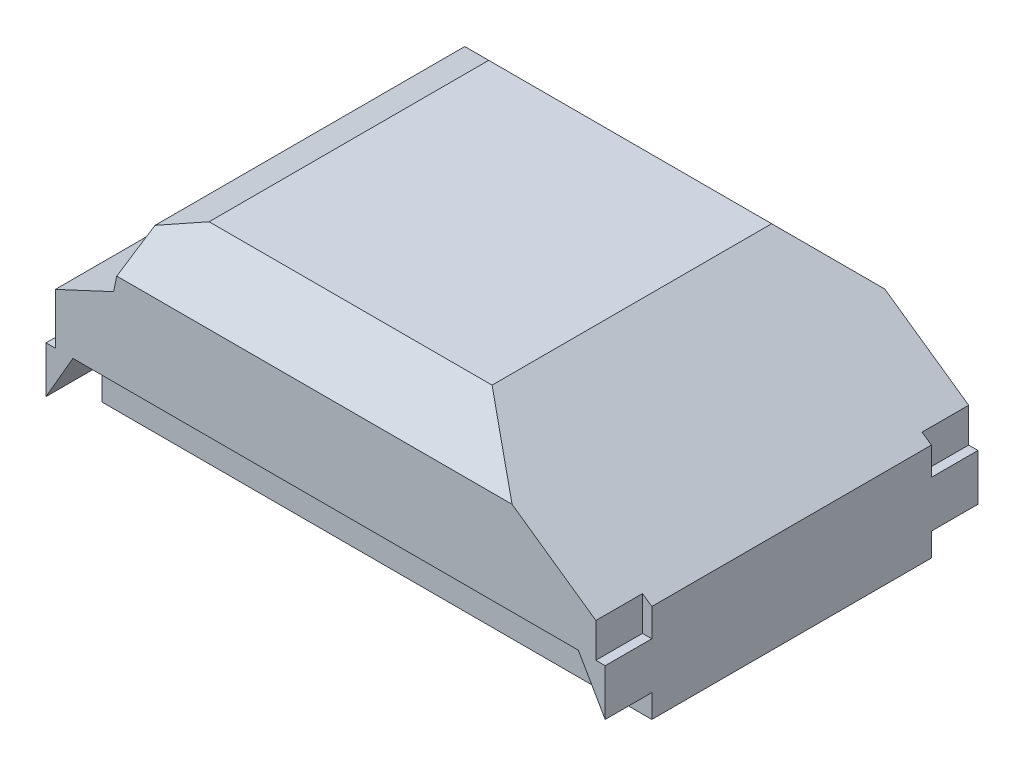
ISO-10303-21;
HEADER;
FILE_DESCRIPTION(('STEP AP214'),'2;1');
FILE_NAME('part.step','',(''),(''),'','','');
FILE_SCHEMA(('AUTOMOTIVE_DESIGN { 1 0 10303 214 1 1 1 1 }'));
ENDSEC;
DATA;
#1=APPLICATION_CONTEXT('core data for automotive mechanical design processes');
#2=APPLICATION_PROTOCOL_DEFINITION('international standard','automotive_design',2000,#1);
#3=PRODUCT_CONTEXT('',#1,'mechanical');
#4=PRODUCT('Part','Part','',(#3));
#5=PRODUCT_RELATED_PRODUCT_CATEGORY('part','',(#4));
#6=PRODUCT_DEFINITION_FORMATION('','',#4);
#7=PRODUCT_DEFINITION_CONTEXT('part definition',#1,'design');
#8=PRODUCT_DEFINITION('design','',#6,#7);
#9=PRODUCT_DEFINITION_SHAPE('','',#8);
#10=(LENGTH_UNIT() NAMED_UNIT(*) SI_UNIT(.MILLI.,.METRE.));
#11=(NAMED_UNIT(*) PLANE_ANGLE_UNIT() SI_UNIT($,.RADIAN.));
#12=(NAMED_UNIT(*) SI_UNIT($,.STERADIAN.) SOLID_ANGLE_UNIT());
#13=UNCERTAINTY_MEASURE_WITH_UNIT(LENGTH_MEASURE(1.E-05),#10,'distance_accuracy_value','');
#14=(GEOMETRIC_REPRESENTATION_CONTEXT(3) GLOBAL_UNCERTAINTY_ASSIGNED_CONTEXT((#13)) GLOBAL_UNIT_ASSIGNED_CONTEXT((#10,
#11,#12)) REPRESENTATION_CONTEXT('',''));
#15=CARTESIAN_POINT('',(0.,0.,0.));
#16=DIRECTION('',(0.,0.,1.));
#17=DIRECTION('',(1.,0.,0.));
#18=AXIS2_PLACEMENT_3D('',#15,#16,#17);
#19=CARTESIAN_POINT('',(0.,74.8916505008483,0.));
#20=DIRECTION('',(0.,-1.,0.));
#21=DIRECTION('',(0.,0.,-1.));
#22=AXIS2_PLACEMENT_3D('',#19,#20,#21);
#23=PLANE('',#22);
#24=DIRECTION('',(0.,0.,-1.));
#25=VECTOR('',#24,1.);
#26=CARTESIAN_POINT('',(113.092371629918,74.8916505008483,195.747597125653));
#27=LINE('',#26,#25);
#28=CARTESIAN_POINT('',(113.092371629918,74.8916505008483,92.1829002882369));
#29=VERTEX_POINT('',#28);
#30=CARTESIAN_POINT('',(113.092371629918,74.8916505008483,79.4829002882369));
#31=VERTEX_POINT('',#30);
#32=EDGE_CURVE('E303',#29,#31,#27,.T.);
#33=ORIENTED_EDGE('',*,*,#32,.F.);
#34=DIRECTION('',(1.,0.,0.));
#35=VECTOR('',#34,1.);
#36=CARTESIAN_POINT('',(-29.4352799513737,74.8916505008483,92.1829002882369));
#37=LINE('',#36,#35);
#38=CARTESIAN_POINT('',(-24.6429315326656,74.8916505008483,92.1829002882369));
#39=VERTEX_POINT('',#38);
#40=EDGE_CURVE('E483',#39,#29,#37,.T.);
#41=ORIENTED_EDGE('',*,*,#40,.F.);
#42=DIRECTION('',(0.,0.,-1.));
#43=VECTOR('',#42,1.);
#44=CARTESIAN_POINT('',(-24.6429315326656,74.8916505008483,195.747597125653));
#45=LINE('',#44,#43);
#46=CARTESIAN_POINT('',(-24.6429315326656,74.8916505008483,79.4829002882369));
#47=VERTEX_POINT('',#46);
#48=EDGE_CURVE('E316',#39,#47,#45,.T.);
#49=ORIENTED_EDGE('',*,*,#48,.T.);
#50=DIRECTION('',(-1.,0.,0.));
#51=VECTOR('',#50,1.);
#52=CARTESIAN_POINT('',(-29.4352799513737,74.8916505008483,79.4829002882369));
#53=LINE('',#52,#51);
#54=EDGE_CURVE('E403',#31,#47,#53,.T.);
#55=ORIENTED_EDGE('',*,*,#54,.F.);
#56=EDGE_LOOP('',(#33,#41,#49,#55));
#57=FACE_BOUND('',#56,.T.);
#58=ADVANCED_FACE('F33',(#57),#23,.T.);
#59=CARTESIAN_POINT('',(-24.6429315326656,74.8916505008483,181.082900288237));
#60=VERTEX_POINT('',#59);
#61=CARTESIAN_POINT('',(-24.6429315326656,74.8916505008483,168.382900288237));
#62=VERTEX_POINT('',#61);
#63=EDGE_CURVE('E325',#60,#62,#45,.T.);
#64=ORIENTED_EDGE('',*,*,#63,.T.);
#65=DIRECTION('',(-1.,0.,0.));
#66=VECTOR('',#65,1.);
#67=CARTESIAN_POINT('',(-29.4352799513737,74.8916505008483,168.382900288237));
#68=LINE('',#67,#66);
#69=CARTESIAN_POINT('',(113.092371629918,74.8916505008483,168.382900288237));
#70=VERTEX_POINT('',#69);
#71=EDGE_CURVE('E248',#70,#62,#68,.T.);
#72=ORIENTED_EDGE('',*,*,#71,.F.);
#73=CARTESIAN_POINT('',(113.092371629918,74.8916505008483,181.082900288237));
#74=VERTEX_POINT('',#73);
#75=EDGE_CURVE('E304',#74,#70,#27,.T.);
#76=ORIENTED_EDGE('',*,*,#75,.F.);
#77=DIRECTION('',(1.,0.,0.));
#78=VECTOR('',#77,1.);
#79=CARTESIAN_POINT('',(117.884720048626,74.8916505008483,181.082900288237));
#80=LINE('',#79,#78);
#81=EDGE_CURVE('E388',#60,#74,#80,.T.);
#82=ORIENTED_EDGE('',*,*,#81,.F.);
#83=EDGE_LOOP('',(#64,#72,#76,#82));
#84=FACE_BOUND('',#83,.T.);
#85=ADVANCED_FACE('F481',(#84),#23,.T.);
#86=CARTESIAN_POINT('',(-31.9752799513737,62.1916505008483,195.747597125653));
#87=DIRECTION('',(-0.866025403784442,0.499999999999995,0.));
#88=DIRECTION('',(-0.499999999999995,-0.866025403784442,0.));
#89=AXIS2_PLACEMENT_3D('',#86,#87,#88);
#90=PLANE('',#89);
#91=DIRECTION('',(0.499999999999995,0.866025403784442,0.));
#92=VECTOR('',#91,1.);
#93=CARTESIAN_POINT('',(-31.9752799513737,62.1916505008483,92.1829002882369));
#94=LINE('',#93,#92);
#95=CARTESIAN_POINT('',(-29.4352799513737,66.5910595520733,92.1829002882369));
#96=VERTEX_POINT('',#95);
#97=EDGE_CURVE('E48',#96,#39,#94,.T.);
#98=ORIENTED_EDGE('',*,*,#97,.F.);
#99=DIRECTION('',(0.,0.,-1.));
#100=VECTOR('',#99,1.);
#101=CARTESIAN_POINT('',(-29.4352799513737,66.5910595520733,195.747597125653));
#102=LINE('',#101,#100);
#103=CARTESIAN_POINT('',(-29.4352799513737,66.5910595520733,168.382900288237));
#104=VERTEX_POINT('',#103);
#105=EDGE_CURVE('E52',#104,#96,#102,.T.);
#106=ORIENTED_EDGE('',*,*,#105,.F.);
#107=DIRECTION('',(-0.499999999999995,-0.866025403784442,0.));
#108=VECTOR('',#107,1.);
#109=CARTESIAN_POINT('',(-31.9752799513737,62.1916505008483,168.382900288237));
#110=LINE('',#109,#108);
#111=EDGE_CURVE('E251',#62,#104,#110,.T.);
#112=ORIENTED_EDGE('',*,*,#111,.F.);
#113=ORIENTED_EDGE('',*,*,#63,.F.);
#114=DIRECTION('',(-0.499999999999995,-0.866025403784442,0.));
#115=VECTOR('',#114,1.);
#116=CARTESIAN_POINT('',(-31.9752799513737,62.1916505008483,181.082900288237));
#117=LINE('',#116,#115);
#118=CARTESIAN_POINT('',(-31.9752799513737,62.1916505008483,181.082900288237));
#119=VERTEX_POINT('',#118);
#120=EDGE_CURVE('E321',#60,#119,#117,.T.);
#121=ORIENTED_EDGE('',*,*,#120,.T.);
#122=DIRECTION('',(0.,0.,-1.));
#123=VECTOR('',#122,1.);
#124=CARTESIAN_POINT('',(-31.9752799513737,62.1916505008483,195.747597125653));
#125=LINE('',#124,#123);
#126=CARTESIAN_POINT('',(-31.9752799513737,62.1916505008483,79.4829002882369));
#127=VERTEX_POINT('',#126);
#128=EDGE_CURVE('E328',#119,#127,#125,.T.);
#129=ORIENTED_EDGE('',*,*,#128,.T.);
#130=DIRECTION('',(-0.499999999999994,-0.866025403784442,0.));
#131=VECTOR('',#130,1.);
#132=CARTESIAN_POINT('',(-31.9752799513737,62.1916505008483,79.4829002882369));
#133=LINE('',#132,#131);
#134=EDGE_CURVE('E296',#47,#127,#133,.T.);
#135=ORIENTED_EDGE('',*,*,#134,.F.);
#136=ORIENTED_EDGE('',*,*,#48,.F.);
#137=EDGE_LOOP('',(#98,#106,#112,#113,#121,#129,#135,#136));
#138=FACE_BOUND('',#137,.T.);
#139=ADVANCED_FACE('F504',(#138),#90,.F.);
#140=CARTESIAN_POINT('',(120.424720048626,62.1916505008483,195.747597125653));
#141=DIRECTION('',(0.866025403784441,0.499999999999997,0.));
#142=DIRECTION('',(-0.499999999999997,0.866025403784441,0.));
#143=AXIS2_PLACEMENT_3D('',#140,#141,#142);
#144=PLANE('',#143);
#145=DIRECTION('',(0.499999999999997,-0.866025403784441,0.));
#146=VECTOR('',#145,1.);
#147=CARTESIAN_POINT('',(120.424720048626,62.1916505008483,92.1829002882369));
#148=LINE('',#147,#146);
#149=CARTESIAN_POINT('',(120.424720048626,62.1916505008483,92.1829002882369));
#150=VERTEX_POINT('',#149);
#151=EDGE_CURVE('E11',#29,#150,#148,.T.);
#152=ORIENTED_EDGE('',*,*,#151,.F.);
#153=ORIENTED_EDGE('',*,*,#32,.T.);
#154=DIRECTION('',(-0.499999999999997,0.866025403784441,0.));
#155=VECTOR('',#154,1.);
#156=CARTESIAN_POINT('',(120.424720048626,62.1916505008483,79.4829002882369));
#157=LINE('',#156,#155);
#158=CARTESIAN_POINT('',(120.424720048626,62.1916505008483,79.4829002882369));
#159=VERTEX_POINT('',#158);
#160=EDGE_CURVE('E287',#159,#31,#157,.T.);
#161=ORIENTED_EDGE('',*,*,#160,.F.);
#162=DIRECTION('',(0.,0.,-1.));
#163=VECTOR('',#162,1.);
#164=CARTESIAN_POINT('',(120.424720048626,62.1916505008483,195.747597125653));
#165=LINE('',#164,#163);
#166=EDGE_CURVE('E299',#150,#159,#165,.T.);
#167=ORIENTED_EDGE('',*,*,#166,.F.);
#168=EDGE_LOOP('',(#152,#153,#161,#167));
#169=FACE_BOUND('',#168,.T.);
#170=ADVANCED_FACE('F499',(#169),#144,.F.);
#171=DIRECTION('',(-0.499999999999997,0.866025403784441,0.));
#172=VECTOR('',#171,1.);
#173=CARTESIAN_POINT('',(120.424720048626,62.1916505008483,168.382900288237));
#174=LINE('',#173,#172);
#175=CARTESIAN_POINT('',(120.424720048626,62.1916505008483,168.382900288237));
#176=VERTEX_POINT('',#175);
#177=EDGE_CURVE('E41',#176,#70,#174,.T.);
#178=ORIENTED_EDGE('',*,*,#177,.F.);
#179=CARTESIAN_POINT('',(120.424720048626,62.1916505008483,181.082900288237));
#180=VERTEX_POINT('',#179);
#181=EDGE_CURVE('E300',#180,#176,#165,.T.);
#182=ORIENTED_EDGE('',*,*,#181,.F.);
#183=DIRECTION('',(-0.499999999999997,0.866025403784441,0.));
#184=VECTOR('',#183,1.);
#185=CARTESIAN_POINT('',(120.424720048626,62.1916505008483,181.082900288237));
#186=LINE('',#185,#184);
#187=EDGE_CURVE('E291',#180,#74,#186,.T.);
#188=ORIENTED_EDGE('',*,*,#187,.T.);
#189=ORIENTED_EDGE('',*,*,#75,.T.);
#190=EDGE_LOOP('',(#178,#182,#188,#189));
#191=FACE_BOUND('',#190,.T.);
#192=ADVANCED_FACE('F469',(#191),#144,.F.);
#193=CARTESIAN_POINT('',(117.884720048626,112.991650500848,181.082900288237));
#194=DIRECTION('',(0.,0.,-1.));
#195=DIRECTION('',(-1.,0.,0.));
#196=AXIS2_PLACEMENT_3D('',#193,#194,#195);
#197=PLANE('',#196);
#198=DIRECTION('',(0.819152044288995,-0.573576436351041,0.));
#199=VECTOR('',#198,1.);
#200=CARTESIAN_POINT('',(76.8947688031261,112.991650500848,181.082900288237));
#201=LINE('',#200,#199);
#202=CARTESIAN_POINT('',(95.0322484887511,100.291650500848,181.082900288237));
#203=VERTEX_POINT('',#202);
#204=CARTESIAN_POINT('',(117.884720048626,84.2901776479009,181.082900288237));
#205=VERTEX_POINT('',#204);
#206=EDGE_CURVE('E324',#203,#205,#201,.T.);
#207=ORIENTED_EDGE('',*,*,#206,.F.);
#208=DIRECTION('',(1.,0.,0.));
#209=VECTOR('',#208,1.);
#210=CARTESIAN_POINT('',(-31.9752799513737,100.291650500848,181.082900288237));
#211=LINE('',#210,#209);
#212=CARTESIAN_POINT('',(-12.6849887689477,100.291650500848,181.082900288237));
#213=VERTEX_POINT('',#212);
#214=EDGE_CURVE('E265',#213,#203,#211,.T.);
#215=ORIENTED_EDGE('',*,*,#214,.F.);
#216=DIRECTION('',(0.207911690817752,0.978147600733807,0.));
#217=VECTOR('',#216,1.);
#218=CARTESIAN_POINT('',(-13.559105718789,96.1792535794193,181.082900288237));
#219=LINE('',#218,#217);
#220=CARTESIAN_POINT('',(-13.559105718789,96.1792535794193,181.082900288237));
#221=VERTEX_POINT('',#220);
#222=EDGE_CURVE('E338',#221,#213,#219,.T.);
#223=ORIENTED_EDGE('',*,*,#222,.F.);
#224=DIRECTION('',(0.906307787036649,0.422618261740701,0.));
#225=VECTOR('',#224,1.);
#226=CARTESIAN_POINT('',(-31.9752799513737,87.5916505008482,181.082900288237));
#227=LINE('',#226,#225);
#228=CARTESIAN_POINT('',(-29.4352799513737,88.7760719525619,181.082900288237));
#229=VERTEX_POINT('',#228);
#230=EDGE_CURVE('E336',#229,#221,#227,.T.);
#231=ORIENTED_EDGE('',*,*,#230,.F.);
#232=DIRECTION('',(0.,-1.,0.));
#233=VECTOR('',#232,1.);
#234=CARTESIAN_POINT('',(-29.4352799513737,112.991650500848,181.082900288237));
#235=LINE('',#234,#233);
#236=CARTESIAN_POINT('',(-29.4352799513737,74.8916505008483,181.082900288237));
#237=VERTEX_POINT('',#236);
#238=EDGE_CURVE('E416',#229,#237,#235,.T.);
#239=ORIENTED_EDGE('',*,*,#238,.T.);
#240=DIRECTION('',(1.,0.,0.));
#241=VECTOR('',#240,1.);
#242=CARTESIAN_POINT('',(-24.6429315326656,74.8916505008483,181.082900288237));
#243=LINE('',#242,#241);
#244=CARTESIAN_POINT('',(-31.9752799513737,74.8916505008483,181.082900288237));
#245=VERTEX_POINT('',#244);
#246=EDGE_CURVE('E320',#245,#237,#243,.T.);
#247=ORIENTED_EDGE('',*,*,#246,.F.);
#248=DIRECTION('',(0.,1.,0.));
#249=VECTOR('',#248,1.);
#250=CARTESIAN_POINT('',(-31.9752799513737,74.8916505008483,181.082900288237));
#251=LINE('',#250,#249);
#252=EDGE_CURVE('E317',#119,#245,#251,.T.);
#253=ORIENTED_EDGE('',*,*,#252,.F.);
#254=ORIENTED_EDGE('',*,*,#120,.F.);
#255=ORIENTED_EDGE('',*,*,#81,.T.);
#256=ORIENTED_EDGE('',*,*,#187,.F.);
#257=DIRECTION('',(0.,-1.,0.));
#258=VECTOR('',#257,1.);
#259=CARTESIAN_POINT('',(120.424720048626,74.8916505008483,181.082900288237));
#260=LINE('',#259,#258);
#261=CARTESIAN_POINT('',(120.424720048626,74.8916505008483,181.082900288237));
#262=VERTEX_POINT('',#261);
#263=EDGE_CURVE('E294',#262,#180,#260,.T.);
#264=ORIENTED_EDGE('',*,*,#263,.F.);
#265=DIRECTION('',(1.,0.,0.));
#266=VECTOR('',#265,1.);
#267=CARTESIAN_POINT('',(113.092371629918,74.8916505008483,181.082900288237));
#268=LINE('',#267,#266);
#269=CARTESIAN_POINT('',(117.884720048626,74.8916505008483,181.082900288237));
#270=VERTEX_POINT('',#269);
#271=EDGE_CURVE('E293',#270,#262,#268,.T.);
#272=ORIENTED_EDGE('',*,*,#271,.F.);
#273=DIRECTION('',(0.,-1.,0.));
#274=VECTOR('',#273,1.);
#275=CARTESIAN_POINT('',(117.884720048626,112.991650500848,181.082900288237));
#276=LINE('',#275,#274);
#277=EDGE_CURVE('E449',#205,#270,#276,.T.);
#278=ORIENTED_EDGE('',*,*,#277,.F.);
#279=EDGE_LOOP('',(#207,#215,#223,#231,#239,#247,#253,#254,#255,#256,#264,#272,#278));
#280=FACE_BOUND('',#279,.T.);
#281=ADVANCED_FACE('F35',(#280),#197,.F.);
#282=CARTESIAN_POINT('',(117.884720048626,112.991650500848,168.382900288237));
#283=DIRECTION('',(-1.,0.,0.));
#284=DIRECTION('',(0.,0.,1.));
#285=AXIS2_PLACEMENT_3D('',#282,#283,#284);
#286=PLANE('',#285);
#287=DIRECTION('',(0.,-1.,0.));
#288=VECTOR('',#287,1.);
#289=CARTESIAN_POINT('',(117.884720048626,112.991650500848,168.382900288237));
#290=LINE('',#289,#288);
#291=CARTESIAN_POINT('',(117.884720048626,84.2901776479009,168.382900288237));
#292=VERTEX_POINT('',#291);
#293=CARTESIAN_POINT('',(117.884720048626,74.8916505008483,168.382900288237));
#294=VERTEX_POINT('',#293);
#295=EDGE_CURVE('E446',#292,#294,#290,.T.);
#296=ORIENTED_EDGE('',*,*,#295,.F.);
#297=DIRECTION('',(0.,0.,1.));
#298=VECTOR('',#297,1.);
#299=CARTESIAN_POINT('',(117.884720048626,84.2901776479009,168.382900288237));
#300=LINE('',#299,#298);
#301=EDGE_CURVE('E376',#292,#205,#300,.T.);
#302=ORIENTED_EDGE('',*,*,#301,.T.);
#303=ORIENTED_EDGE('',*,*,#277,.T.);
#304=DIRECTION('',(0.,0.,-1.));
#305=VECTOR('',#304,1.);
#306=CARTESIAN_POINT('',(117.884720048626,74.8916505008483,168.382900288237));
#307=LINE('',#306,#305);
#308=EDGE_CURVE('E391',#270,#294,#307,.T.);
#309=ORIENTED_EDGE('',*,*,#308,.T.);
#310=EDGE_LOOP('',(#296,#302,#303,#309));
#311=FACE_BOUND('',#310,.T.);
#312=ADVANCED_FACE('F554',(#311),#286,.F.);
#313=CARTESIAN_POINT('',(120.424720048626,112.991650500848,168.382900288237));
#314=DIRECTION('',(0.,0.,-1.));
#315=DIRECTION('',(-1.,0.,0.));
#316=AXIS2_PLACEMENT_3D('',#313,#314,#315);
#317=PLANE('',#316);
#318=DIRECTION('',(0.,-1.,0.));
#319=VECTOR('',#318,1.);
#320=CARTESIAN_POINT('',(120.424720048626,112.991650500848,168.382900288237));
#321=LINE('',#320,#319);
#322=CARTESIAN_POINT('',(120.424720048626,82.5116505008483,168.382900288237));
#323=VERTEX_POINT('',#322);
#324=CARTESIAN_POINT('',(120.424720048626,74.8916505008483,168.382900288237));
#325=VERTEX_POINT('',#324);
#326=EDGE_CURVE('E443',#323,#325,#321,.T.);
#327=ORIENTED_EDGE('',*,*,#326,.F.);
#328=DIRECTION('',(-0.819152044288995,0.573576436351041,0.));
#329=VECTOR('',#328,1.);
#330=CARTESIAN_POINT('',(106.103804507849,92.5392635165649,168.382900288237));
#331=LINE('',#330,#329);
#332=EDGE_CURVE('E373',#323,#292,#331,.T.);
#333=ORIENTED_EDGE('',*,*,#332,.T.);
#334=ORIENTED_EDGE('',*,*,#295,.T.);
#335=DIRECTION('',(1.,0.,0.));
#336=VECTOR('',#335,1.);
#337=CARTESIAN_POINT('',(120.424720048626,74.8916505008483,168.382900288237));
#338=LINE('',#337,#336);
#339=EDGE_CURVE('E394',#294,#325,#338,.T.);
#340=ORIENTED_EDGE('',*,*,#339,.T.);
#341=EDGE_LOOP('',(#327,#333,#334,#340));
#342=FACE_BOUND('',#341,.T.);
#343=ADVANCED_FACE('F549',(#342),#317,.F.);
#344=CARTESIAN_POINT('',(120.424720048626,112.991650500848,92.1829002882369));
#345=DIRECTION('',(-1.,0.,0.));
#346=DIRECTION('',(0.,0.,1.));
#347=AXIS2_PLACEMENT_3D('',#344,#345,#346);
#348=PLANE('',#347);
#349=ORIENTED_EDGE('',*,*,#326,.T.);
#350=DIRECTION('',(0.,0.,-1.));
#351=VECTOR('',#350,1.);
#352=CARTESIAN_POINT('',(120.424720048626,74.8916505008483,195.747597125653));
#353=LINE('',#352,#351);
#354=EDGE_CURVE('E297',#262,#325,#353,.T.);
#355=ORIENTED_EDGE('',*,*,#354,.F.);
#356=ORIENTED_EDGE('',*,*,#263,.T.);
#357=ORIENTED_EDGE('',*,*,#181,.T.);
#358=DIRECTION('',(0.,1.,0.));
#359=VECTOR('',#358,1.);
#360=CARTESIAN_POINT('',(120.424720048626,55.8416505008483,168.382900288237));
#361=LINE('',#360,#359);
#362=CARTESIAN_POINT('',(120.424720048626,55.8416505008483,168.382900288237));
#363=VERTEX_POINT('',#362);
#364=EDGE_CURVE('E254',#363,#176,#361,.T.);
#365=ORIENTED_EDGE('',*,*,#364,.F.);
#366=DIRECTION('',(0.,0.,1.));
#367=VECTOR('',#366,1.);
#368=CARTESIAN_POINT('',(120.424720048626,55.8416505008483,168.382900288237));
#369=LINE('',#368,#367);
#370=CARTESIAN_POINT('',(120.424720048626,55.8416505008483,92.1829002882369));
#371=VERTEX_POINT('',#370);
#372=EDGE_CURVE('E238',#371,#363,#369,.T.);
#373=ORIENTED_EDGE('',*,*,#372,.F.);
#374=DIRECTION('',(0.,1.,0.));
#375=VECTOR('',#374,1.);
#376=CARTESIAN_POINT('',(120.424720048626,55.8416505008483,92.1829002882369));
#377=LINE('',#376,#375);
#378=EDGE_CURVE('E235',#371,#150,#377,.T.);
#379=ORIENTED_EDGE('',*,*,#378,.T.);
#380=ORIENTED_EDGE('',*,*,#166,.T.);
#381=DIRECTION('',(0.,-1.,0.));
#382=VECTOR('',#381,1.);
#383=CARTESIAN_POINT('',(120.424720048626,74.8916505008483,79.4829002882369));
#384=LINE('',#383,#382);
#385=CARTESIAN_POINT('',(120.424720048626,74.8916505008483,79.4829002882369));
#386=VERTEX_POINT('',#385);
#387=EDGE_CURVE('E282',#386,#159,#384,.T.);
#388=ORIENTED_EDGE('',*,*,#387,.F.);
#389=CARTESIAN_POINT('',(120.424720048626,74.8916505008483,92.1829002882369));
#390=VERTEX_POINT('',#389);
#391=EDGE_CURVE('E290',#390,#386,#353,.T.);
#392=ORIENTED_EDGE('',*,*,#391,.F.);
#393=DIRECTION('',(0.,-1.,0.));
#394=VECTOR('',#393,1.);
#395=CARTESIAN_POINT('',(120.424720048626,112.991650500848,92.1829002882369));
#396=LINE('',#395,#394);
#397=CARTESIAN_POINT('',(120.424720048626,82.5116505008483,92.1829002882369));
#398=VERTEX_POINT('',#397);
#399=EDGE_CURVE('E440',#398,#390,#396,.T.);
#400=ORIENTED_EDGE('',*,*,#399,.F.);
#401=DIRECTION('',(0.,0.,1.));
#402=VECTOR('',#401,1.);
#403=CARTESIAN_POINT('',(120.424720048626,82.5116505008483,79.4829002882369));
#404=LINE('',#403,#402);
#405=EDGE_CURVE('E339',#398,#323,#404,.T.);
#406=ORIENTED_EDGE('',*,*,#405,.T.);
#407=EDGE_LOOP('',(#349,#355,#356,#357,#365,#373,#379,#380,#388,#392,#400,#406));
#408=FACE_BOUND('',#407,.T.);
#409=ADVANCED_FACE('F472',(#408),#348,.F.);
#410=CARTESIAN_POINT('',(117.884720048626,112.991650500848,92.1829002882369));
#411=DIRECTION('',(0.,0.,1.));
#412=DIRECTION('',(1.,0.,0.));
#413=AXIS2_PLACEMENT_3D('',#410,#411,#412);
#414=PLANE('',#413);
#415=DIRECTION('',(0.,-1.,0.));
#416=VECTOR('',#415,1.);
#417=CARTESIAN_POINT('',(117.884720048626,112.991650500848,92.1829002882369));
#418=LINE('',#417,#416);
#419=CARTESIAN_POINT('',(117.884720048626,84.2901776479009,92.1829002882369));
#420=VERTEX_POINT('',#419);
#421=CARTESIAN_POINT('',(117.884720048626,74.8916505008483,92.1829002882369));
#422=VERTEX_POINT('',#421);
#423=EDGE_CURVE('E437',#420,#422,#418,.T.);
#424=ORIENTED_EDGE('',*,*,#423,.F.);
#425=DIRECTION('',(0.819152044288995,-0.573576436351041,0.));
#426=VECTOR('',#425,1.);
#427=CARTESIAN_POINT('',(104.399438925825,93.732673144963,92.1829002882369));
#428=LINE('',#427,#426);
#429=EDGE_CURVE('E370',#420,#398,#428,.T.);
#430=ORIENTED_EDGE('',*,*,#429,.T.);
#431=ORIENTED_EDGE('',*,*,#399,.T.);
#432=DIRECTION('',(-1.,0.,0.));
#433=VECTOR('',#432,1.);
#434=CARTESIAN_POINT('',(117.884720048626,74.8916505008483,92.1829002882369));
#435=LINE('',#434,#433);
#436=EDGE_CURVE('E397',#390,#422,#435,.T.);
#437=ORIENTED_EDGE('',*,*,#436,.T.);
#438=EDGE_LOOP('',(#424,#430,#431,#437));
#439=FACE_BOUND('',#438,.T.);
#440=ADVANCED_FACE('F546',(#439),#414,.F.);
#441=CARTESIAN_POINT('',(117.884720048626,112.991650500848,79.4829002882369));
#442=DIRECTION('',(-1.,0.,0.));
#443=DIRECTION('',(0.,0.,1.));
#444=AXIS2_PLACEMENT_3D('',#441,#442,#443);
#445=PLANE('',#444);
#446=DIRECTION('',(0.,-1.,0.));
#447=VECTOR('',#446,1.);
#448=CARTESIAN_POINT('',(117.884720048626,112.991650500848,79.4829002882369));
#449=LINE('',#448,#447);
#450=CARTESIAN_POINT('',(117.884720048626,84.2901776479009,79.4829002882369));
#451=VERTEX_POINT('',#450);
#452=CARTESIAN_POINT('',(117.884720048626,74.8916505008483,79.4829002882369));
#453=VERTEX_POINT('',#452);
#454=EDGE_CURVE('E434',#451,#453,#449,.T.);
#455=ORIENTED_EDGE('',*,*,#454,.F.);
#456=DIRECTION('',(0.,0.,1.));
#457=VECTOR('',#456,1.);
#458=CARTESIAN_POINT('',(117.884720048626,84.2901776479009,79.4829002882369));
#459=LINE('',#458,#457);
#460=EDGE_CURVE('E352',#451,#420,#459,.T.);
#461=ORIENTED_EDGE('',*,*,#460,.T.);
#462=ORIENTED_EDGE('',*,*,#423,.T.);
#463=DIRECTION('',(0.,0.,-1.));
#464=VECTOR('',#463,1.);
#465=CARTESIAN_POINT('',(117.884720048626,74.8916505008483,79.4829002882369));
#466=LINE('',#465,#464);
#467=EDGE_CURVE('E400',#422,#453,#466,.T.);
#468=ORIENTED_EDGE('',*,*,#467,.T.);
#469=EDGE_LOOP('',(#455,#461,#462,#468));
#470=FACE_BOUND('',#469,.T.);
#471=ADVANCED_FACE('F540',(#470),#445,.F.);
#472=CARTESIAN_POINT('',(-29.4352799513737,112.991650500848,79.4829002882369));
#473=DIRECTION('',(0.,0.,1.));
#474=DIRECTION('',(1.,0.,0.));
#475=AXIS2_PLACEMENT_3D('',#472,#473,#474);
#476=PLANE('',#475);
#477=DIRECTION('',(0.207911690817752,0.978147600733807,0.));
#478=VECTOR('',#477,1.);
#479=CARTESIAN_POINT('',(-13.559105718789,96.1792535794193,79.4829002882369));
#480=LINE('',#479,#478);
#481=CARTESIAN_POINT('',(-13.559105718789,96.1792535794193,79.4829002882369));
#482=VERTEX_POINT('',#481);
#483=CARTESIAN_POINT('',(-12.6849887689477,100.291650500848,79.4829002882369));
#484=VERTEX_POINT('',#483);
#485=EDGE_CURVE('E345',#482,#484,#480,.T.);
#486=ORIENTED_EDGE('',*,*,#485,.T.);
#487=DIRECTION('',(1.,0.,0.));
#488=VECTOR('',#487,1.);
#489=CARTESIAN_POINT('',(-31.9752799513737,100.291650500848,79.4829002882368));
#490=LINE('',#489,#488);
#491=CARTESIAN_POINT('',(95.0322484887513,100.291650500848,79.4829002882368));
#492=VERTEX_POINT('',#491);
#493=EDGE_CURVE('E267',#484,#492,#490,.T.);
#494=ORIENTED_EDGE('',*,*,#493,.T.);
#495=DIRECTION('',(0.819152044288995,-0.573576436351041,0.));
#496=VECTOR('',#495,1.);
#497=CARTESIAN_POINT('',(76.8947688031261,112.991650500848,79.4829002882369));
#498=LINE('',#497,#496);
#499=EDGE_CURVE('E361',#492,#451,#498,.T.);
#500=ORIENTED_EDGE('',*,*,#499,.T.);
#501=ORIENTED_EDGE('',*,*,#454,.T.);
#502=DIRECTION('',(1.,0.,0.));
#503=VECTOR('',#502,1.);
#504=CARTESIAN_POINT('',(113.092371629918,74.8916505008483,79.4829002882369));
#505=LINE('',#504,#503);
#506=EDGE_CURVE('E285',#453,#386,#505,.T.);
#507=ORIENTED_EDGE('',*,*,#506,.T.);
#508=ORIENTED_EDGE('',*,*,#387,.T.);
#509=ORIENTED_EDGE('',*,*,#160,.T.);
#510=ORIENTED_EDGE('',*,*,#54,.T.);
#511=ORIENTED_EDGE('',*,*,#134,.T.);
#512=DIRECTION('',(0.,1.,0.));
#513=VECTOR('',#512,1.);
#514=CARTESIAN_POINT('',(-31.9752799513737,74.8916505008483,79.4829002882369));
#515=LINE('',#514,#513);
#516=CARTESIAN_POINT('',(-31.9752799513737,74.8916505008483,79.4829002882369));
#517=VERTEX_POINT('',#516);
#518=EDGE_CURVE('E313',#127,#517,#515,.T.);
#519=ORIENTED_EDGE('',*,*,#518,.T.);
#520=DIRECTION('',(1.,0.,0.));
#521=VECTOR('',#520,1.);
#522=CARTESIAN_POINT('',(-24.6429315326656,74.8916505008483,79.4829002882369));
#523=LINE('',#522,#521);
#524=CARTESIAN_POINT('',(-29.4352799513737,74.8916505008483,79.4829002882369));
#525=VERTEX_POINT('',#524);
#526=EDGE_CURVE('E310',#517,#525,#523,.T.);
#527=ORIENTED_EDGE('',*,*,#526,.T.);
#528=DIRECTION('',(0.,-1.,0.));
#529=VECTOR('',#528,1.);
#530=CARTESIAN_POINT('',(-29.4352799513737,112.991650500848,79.4829002882369));
#531=LINE('',#530,#529);
#532=CARTESIAN_POINT('',(-29.4352799513737,88.7760719525619,79.4829002882369));
#533=VERTEX_POINT('',#532);
#534=EDGE_CURVE('E431',#533,#525,#531,.T.);
#535=ORIENTED_EDGE('',*,*,#534,.F.);
#536=DIRECTION('',(0.906307787036649,0.422618261740701,0.));
#537=VECTOR('',#536,1.);
#538=CARTESIAN_POINT('',(-31.9752799513737,87.5916505008482,79.4829002882369));
#539=LINE('',#538,#537);
#540=EDGE_CURVE('E342',#533,#482,#539,.T.);
#541=ORIENTED_EDGE('',*,*,#540,.T.);
#542=EDGE_LOOP('',(#486,#494,#500,#501,#507,#508,#509,#510,#511,#519,#527,#535,#541));
#543=FACE_BOUND('',#542,.T.);
#544=ADVANCED_FACE('F496',(#543),#476,.F.);
#545=CARTESIAN_POINT('',(-29.4352799513737,112.991650500848,111.232900288237));
#546=DIRECTION('',(1.,0.,0.));
#547=DIRECTION('',(0.,0.,-1.));
#548=AXIS2_PLACEMENT_3D('',#545,#546,#547);
#549=PLANE('',#548);
#550=DIRECTION('',(0.,-1.,0.));
#551=VECTOR('',#550,1.);
#552=CARTESIAN_POINT('',(-29.4352799513737,112.991650500848,111.232900288237));
#553=LINE('',#552,#551);
#554=CARTESIAN_POINT('',(-29.4352799513737,88.7760719525619,111.232900288237));
#555=VERTEX_POINT('',#554);
#556=CARTESIAN_POINT('',(-29.4352799513737,74.8916505008483,111.232900288237));
#557=VERTEX_POINT('',#556);
#558=EDGE_CURVE('E428',#555,#557,#553,.T.);
#559=ORIENTED_EDGE('',*,*,#558,.F.);
#560=DIRECTION('',(0.,0.,-1.));
#561=VECTOR('',#560,1.);
#562=CARTESIAN_POINT('',(-29.4352799513737,88.7760719525619,111.232900288237));
#563=LINE('',#562,#561);
#564=EDGE_CURVE('E385',#555,#533,#563,.T.);
#565=ORIENTED_EDGE('',*,*,#564,.T.);
#566=ORIENTED_EDGE('',*,*,#534,.T.);
#567=DIRECTION('',(0.,0.,1.));
#568=VECTOR('',#567,1.);
#569=CARTESIAN_POINT('',(-29.4352799513737,74.8916505008483,111.232900288237));
#570=LINE('',#569,#568);
#571=EDGE_CURVE('E406',#525,#557,#570,.T.);
#572=ORIENTED_EDGE('',*,*,#571,.T.);
#573=EDGE_LOOP('',(#559,#565,#566,#572));
#574=FACE_BOUND('',#573,.T.);
#575=ADVANCED_FACE('F516',(#574),#549,.F.);
#576=CARTESIAN_POINT('',(-31.9752799513737,112.991650500848,111.232900288237));
#577=DIRECTION('',(0.,0.,1.));
#578=DIRECTION('',(1.,0.,0.));
#579=AXIS2_PLACEMENT_3D('',#576,#577,#578);
#580=PLANE('',#579);
#581=DIRECTION('',(0.,-1.,0.));
#582=VECTOR('',#581,1.);
#583=CARTESIAN_POINT('',(-31.9752799513737,112.991650500848,111.232900288237));
#584=LINE('',#583,#582);
#585=CARTESIAN_POINT('',(-31.9752799513737,87.5916505008482,111.232900288237));
#586=VERTEX_POINT('',#585);
#587=CARTESIAN_POINT('',(-31.9752799513737,74.8916505008483,111.232900288237));
#588=VERTEX_POINT('',#587);
#589=EDGE_CURVE('E425',#586,#588,#584,.T.);
#590=ORIENTED_EDGE('',*,*,#589,.F.);
#591=DIRECTION('',(0.906307787036649,0.422618261740701,0.));
#592=VECTOR('',#591,1.);
#593=CARTESIAN_POINT('',(-22.2465155237627,92.1282478578292,111.232900288237));
#594=LINE('',#593,#592);
#595=EDGE_CURVE('E382',#586,#555,#594,.T.);
#596=ORIENTED_EDGE('',*,*,#595,.T.);
#597=ORIENTED_EDGE('',*,*,#558,.T.);
#598=DIRECTION('',(-1.,0.,0.));
#599=VECTOR('',#598,1.);
#600=CARTESIAN_POINT('',(-31.9752799513737,74.8916505008483,111.232900288237));
#601=LINE('',#600,#599);
#602=EDGE_CURVE('E408',#557,#588,#601,.T.);
#603=ORIENTED_EDGE('',*,*,#602,.T.);
#604=EDGE_LOOP('',(#590,#596,#597,#603));
#605=FACE_BOUND('',#604,.T.);
#606=ADVANCED_FACE('F570',(#605),#580,.F.);
#607=CARTESIAN_POINT('',(-31.9752799513737,112.991650500848,149.332900288237));
#608=DIRECTION('',(1.,0.,0.));
#609=DIRECTION('',(0.,0.,-1.));
#610=AXIS2_PLACEMENT_3D('',#607,#608,#609);
#611=PLANE('',#610);
#612=DIRECTION('',(0.,-1.,0.));
#613=VECTOR('',#612,1.);
#614=CARTESIAN_POINT('',(-31.9752799513737,112.991650500848,149.332900288237));
#615=LINE('',#614,#613);
#616=CARTESIAN_POINT('',(-31.9752799513737,87.5916505008482,149.332900288237));
#617=VERTEX_POINT('',#616);
#618=CARTESIAN_POINT('',(-31.9752799513737,74.8916505008483,149.332900288237));
#619=VERTEX_POINT('',#618);
#620=EDGE_CURVE('E422',#617,#619,#615,.T.);
#621=ORIENTED_EDGE('',*,*,#620,.F.);
#622=DIRECTION('',(0.,0.,1.));
#623=VECTOR('',#622,1.);
#624=CARTESIAN_POINT('',(-31.9752799513737,87.5916505008482,79.4829002882369));
#625=LINE('',#624,#623);
#626=EDGE_CURVE('E348',#586,#617,#625,.T.);
#627=ORIENTED_EDGE('',*,*,#626,.F.);
#628=ORIENTED_EDGE('',*,*,#589,.T.);
#629=DIRECTION('',(0.,0.,-1.));
#630=VECTOR('',#629,1.);
#631=CARTESIAN_POINT('',(-31.9752799513737,74.8916505008483,195.747597125653));
#632=LINE('',#631,#630);
#633=EDGE_CURVE('E330',#588,#517,#632,.T.);
#634=ORIENTED_EDGE('',*,*,#633,.T.);
#635=ORIENTED_EDGE('',*,*,#518,.F.);
#636=ORIENTED_EDGE('',*,*,#128,.F.);
#637=ORIENTED_EDGE('',*,*,#252,.T.);
#638=EDGE_CURVE('E331',#245,#619,#632,.T.);
#639=ORIENTED_EDGE('',*,*,#638,.T.);
#640=EDGE_LOOP('',(#621,#627,#628,#634,#635,#636,#637,#639));
#641=FACE_BOUND('',#640,.T.);
#642=ADVANCED_FACE('F508',(#641),#611,.F.);
#643=CARTESIAN_POINT('',(-29.4352799513737,112.991650500848,149.332900288237));
#644=DIRECTION('',(0.,0.,-1.));
#645=DIRECTION('',(-1.,0.,0.));
#646=AXIS2_PLACEMENT_3D('',#643,#644,#645);
#647=PLANE('',#646);
#648=DIRECTION('',(0.,-1.,0.));
#649=VECTOR('',#648,1.);
#650=CARTESIAN_POINT('',(-29.4352799513737,112.991650500848,149.332900288237));
#651=LINE('',#650,#649);
#652=CARTESIAN_POINT('',(-29.4352799513737,88.7760719525619,149.332900288237));
#653=VERTEX_POINT('',#652);
#654=CARTESIAN_POINT('',(-29.4352799513737,74.8916505008483,149.332900288237));
#655=VERTEX_POINT('',#654);
#656=EDGE_CURVE('E419',#653,#655,#651,.T.);
#657=ORIENTED_EDGE('',*,*,#656,.F.);
#658=DIRECTION('',(-0.906307787036649,-0.422618261740701,0.));
#659=VECTOR('',#658,1.);
#660=CARTESIAN_POINT('',(-20.1601752594608,93.1011243005903,149.332900288237));
#661=LINE('',#660,#659);
#662=EDGE_CURVE('E379',#653,#617,#661,.T.);
#663=ORIENTED_EDGE('',*,*,#662,.T.);
#664=ORIENTED_EDGE('',*,*,#620,.T.);
#665=DIRECTION('',(1.,0.,0.));
#666=VECTOR('',#665,1.);
#667=CARTESIAN_POINT('',(-29.4352799513737,74.8916505008483,149.332900288237));
#668=LINE('',#667,#666);
#669=EDGE_CURVE('E411',#619,#655,#668,.T.);
#670=ORIENTED_EDGE('',*,*,#669,.T.);
#671=EDGE_LOOP('',(#657,#663,#664,#670));
#672=FACE_BOUND('',#671,.T.);
#673=ADVANCED_FACE('F567',(#672),#647,.F.);
#674=CARTESIAN_POINT('',(-29.4352799513737,112.991650500848,181.082900288237));
#675=DIRECTION('',(1.,0.,0.));
#676=DIRECTION('',(0.,0.,-1.));
#677=AXIS2_PLACEMENT_3D('',#674,#675,#676);
#678=PLANE('',#677);
#679=ORIENTED_EDGE('',*,*,#238,.F.);
#680=DIRECTION('',(0.,0.,-1.));
#681=VECTOR('',#680,1.);
#682=CARTESIAN_POINT('',(-29.4352799513737,88.7760719525619,181.082900288237));
#683=LINE('',#682,#681);
#684=EDGE_CURVE('E452',#229,#653,#683,.T.);
#685=ORIENTED_EDGE('',*,*,#684,.T.);
#686=ORIENTED_EDGE('',*,*,#656,.T.);
#687=DIRECTION('',(0.,0.,1.));
#688=VECTOR('',#687,1.);
#689=CARTESIAN_POINT('',(-29.4352799513737,74.8916505008483,181.082900288237));
#690=LINE('',#689,#688);
#691=EDGE_CURVE('E414',#655,#237,#690,.T.);
#692=ORIENTED_EDGE('',*,*,#691,.T.);
#693=EDGE_LOOP('',(#679,#685,#686,#692));
#694=FACE_BOUND('',#693,.T.);
#695=ADVANCED_FACE('F560',(#694),#678,.F.);
#696=CARTESIAN_POINT('',(0.,112.991650500848,0.));
#697=DIRECTION('',(0.,-1.,0.));
#698=DIRECTION('',(0.,0.,-1.));
#699=AXIS2_PLACEMENT_3D('',#696,#697,#698);
#700=PLANE('',#699);
#701=DIRECTION('',(0.,0.,1.));
#702=VECTOR('',#701,1.);
#703=CARTESIAN_POINT('',(-0.225279951373739,112.991650500848,79.4829002882369));
#704=LINE('',#703,#702);
#705=CARTESIAN_POINT('',(-0.225279951373876,112.991650500848,92.1829002882367));
#706=VERTEX_POINT('',#705);
#707=CARTESIAN_POINT('',(-0.225279951373723,112.991650500848,168.382900288237));
#708=VERTEX_POINT('',#707);
#709=EDGE_CURVE('E349',#706,#708,#704,.T.);
#710=ORIENTED_EDGE('',*,*,#709,.T.);
#711=DIRECTION('',(1.,0.,0.));
#712=VECTOR('',#711,1.);
#713=CARTESIAN_POINT('',(-31.9752799513737,112.991650500848,168.382900288237));
#714=LINE('',#713,#712);
#715=CARTESIAN_POINT('',(76.8947688031261,112.991650500848,168.382900288237));
#716=VERTEX_POINT('',#715);
#717=EDGE_CURVE('E261',#708,#716,#714,.T.);
#718=ORIENTED_EDGE('',*,*,#717,.T.);
#719=DIRECTION('',(0.,0.,1.));
#720=VECTOR('',#719,1.);
#721=CARTESIAN_POINT('',(76.8947688031261,112.991650500848,79.4829002882369));
#722=LINE('',#721,#720);
#723=CARTESIAN_POINT('',(76.8947688031262,112.991650500848,92.1829002882367));
#724=VERTEX_POINT('',#723);
#725=EDGE_CURVE('E363',#724,#716,#722,.T.);
#726=ORIENTED_EDGE('',*,*,#725,.F.);
#727=DIRECTION('',(1.,0.,0.));
#728=VECTOR('',#727,1.);
#729=CARTESIAN_POINT('',(-31.9752799513737,112.991650500848,92.1829002882367));
#730=LINE('',#729,#728);
#731=EDGE_CURVE('E260',#706,#724,#730,.T.);
#732=ORIENTED_EDGE('',*,*,#731,.F.);
#733=EDGE_LOOP('',(#710,#718,#726,#732));
#734=FACE_BOUND('',#733,.T.);
#735=ADVANCED_FACE('F532',(#734),#700,.F.);
#736=CARTESIAN_POINT('',(76.8947688031261,112.991650500848,79.4829002882369));
#737=DIRECTION('',(-0.573576436351041,-0.819152044288995,0.));
#738=DIRECTION('',(0.819152044288995,-0.573576436351041,0.));
#739=AXIS2_PLACEMENT_3D('',#736,#737,#738);
#740=PLANE('',#739);
#741=ORIENTED_EDGE('',*,*,#725,.T.);
#742=DIRECTION('',(0.710564775461636,-0.497542812164521,0.497542812164515));
#743=VECTOR('',#742,1.);
#744=CARTESIAN_POINT('',(45.4653831446544,134.99874326021,146.375807528876));
#745=LINE('',#744,#743);
#746=EDGE_CURVE('E279',#716,#203,#745,.T.);
#747=ORIENTED_EDGE('',*,*,#746,.T.);
#748=ORIENTED_EDGE('',*,*,#206,.T.);
#749=ORIENTED_EDGE('',*,*,#301,.F.);
#750=ORIENTED_EDGE('',*,*,#332,.F.);
#751=ORIENTED_EDGE('',*,*,#405,.F.);
#752=ORIENTED_EDGE('',*,*,#429,.F.);
#753=ORIENTED_EDGE('',*,*,#460,.F.);
#754=ORIENTED_EDGE('',*,*,#499,.F.);
#755=DIRECTION('',(-0.710564775461636,0.497542812164521,0.497542812164515));
#756=VECTOR('',#755,1.);
#757=CARTESIAN_POINT('',(81.3846810400506,109.847780106654,89.0390298940423));
#758=LINE('',#757,#756);
#759=EDGE_CURVE('E273',#492,#724,#758,.T.);
#760=ORIENTED_EDGE('',*,*,#759,.T.);
#761=EDGE_LOOP('',(#741,#747,#748,#749,#750,#751,#752,#753,#754,#760));
#762=FACE_BOUND('',#761,.T.);
#763=ADVANCED_FACE('F536',(#762),#740,.F.);
#764=CARTESIAN_POINT('',(-31.9752799513737,87.5916505008482,79.4829002882369));
#765=DIRECTION('',(0.422618261740701,-0.906307787036649,0.));
#766=DIRECTION('',(0.906307787036649,0.422618261740701,0.));
#767=AXIS2_PLACEMENT_3D('',#764,#765,#766);
#768=PLANE('',#767);
#769=ORIENTED_EDGE('',*,*,#595,.F.);
#770=ORIENTED_EDGE('',*,*,#626,.T.);
#771=ORIENTED_EDGE('',*,*,#662,.F.);
#772=ORIENTED_EDGE('',*,*,#684,.F.);
#773=ORIENTED_EDGE('',*,*,#230,.T.);
#774=DIRECTION('',(0.,0.,1.));
#775=VECTOR('',#774,1.);
#776=CARTESIAN_POINT('',(-13.559105718789,96.1792535794193,79.4829002882369));
#777=LINE('',#776,#775);
#778=EDGE_CURVE('E356',#482,#221,#777,.T.);
#779=ORIENTED_EDGE('',*,*,#778,.F.);
#780=ORIENTED_EDGE('',*,*,#540,.F.);
#781=ORIENTED_EDGE('',*,*,#564,.F.);
#782=EDGE_LOOP('',(#769,#770,#771,#772,#773,#779,#780,#781));
#783=FACE_BOUND('',#782,.T.);
#784=ADVANCED_FACE('F519',(#783),#768,.F.);
#785=CARTESIAN_POINT('',(-10.8596373855798,108.879253579419,79.4829002882369));
#786=DIRECTION('',(0.360679174240507,-0.932689944874065,0.));
#787=DIRECTION('',(0.932689944874065,0.360679174240507,0.));
#788=AXIS2_PLACEMENT_3D('',#785,#786,#787);
#789=PLANE('',#788);
#790=DIRECTION('',(0.,0.,1.));
#791=VECTOR('',#790,1.);
#792=CARTESIAN_POINT('',(-10.8596373855798,108.879253579419,79.4829002882369));
#793=LINE('',#792,#791);
#794=CARTESIAN_POINT('',(-10.8596373855798,108.879253579419,88.0705033668078));
#795=VERTEX_POINT('',#794);
#796=CARTESIAN_POINT('',(-10.8596373855798,108.879253579419,172.495297209666));
#797=VERTEX_POINT('',#796);
#798=EDGE_CURVE('E353',#795,#797,#793,.T.);
#799=ORIENTED_EDGE('',*,*,#798,.T.);
#800=DIRECTION('',(0.877366163224706,0.339284994973519,-0.339284994973515));
#801=VECTOR('',#800,1.);
#802=CARTESIAN_POINT('',(16.8280301029662,119.586311269167,161.788239519918));
#803=LINE('',#802,#801);
#804=EDGE_CURVE('E276',#797,#708,#803,.T.);
#805=ORIENTED_EDGE('',*,*,#804,.T.);
#806=ORIENTED_EDGE('',*,*,#709,.F.);
#807=DIRECTION('',(-0.877366163224706,-0.339284994973519,-0.339284994973515));
#808=VECTOR('',#807,1.);
#809=CARTESIAN_POINT('',(-13.4159708038439,107.890697595247,87.0819473826352));
#810=LINE('',#809,#808);
#811=EDGE_CURVE('E264',#706,#795,#810,.T.);
#812=ORIENTED_EDGE('',*,*,#811,.T.);
#813=EDGE_LOOP('',(#799,#805,#806,#812));
#814=FACE_BOUND('',#813,.T.);
#815=ADVANCED_FACE('F530',(#814),#789,.F.);
#816=CARTESIAN_POINT('',(-13.559105718789,96.1792535794193,79.4829002882369));
#817=DIRECTION('',(0.978147600733807,-0.207911690817752,0.));
#818=DIRECTION('',(0.207911690817752,0.978147600733807,0.));
#819=AXIS2_PLACEMENT_3D('',#816,#817,#818);
#820=PLANE('',#819);
#821=ORIENTED_EDGE('',*,*,#222,.T.);
#822=DIRECTION('',(0.148630766248353,0.69925277808688,-0.699252778086872));
#823=VECTOR('',#822,1.);
#824=CARTESIAN_POINT('',(-2.57236596561975,147.867800227185,133.5067505619));
#825=LINE('',#824,#823);
#826=EDGE_CURVE('E458',#213,#797,#825,.T.);
#827=ORIENTED_EDGE('',*,*,#826,.T.);
#828=ORIENTED_EDGE('',*,*,#798,.F.);
#829=DIRECTION('',(-0.148630766248353,-0.69925277808688,-0.699252778086872));
#830=VECTOR('',#829,1.);
#831=CARTESIAN_POINT('',(-13.1317023483872,98.1900283447043,77.381278132093));
#832=LINE('',#831,#830);
#833=EDGE_CURVE('E455',#795,#484,#832,.T.);
#834=ORIENTED_EDGE('',*,*,#833,.T.);
#835=ORIENTED_EDGE('',*,*,#485,.F.);
#836=ORIENTED_EDGE('',*,*,#778,.T.);
#837=EDGE_LOOP('',(#821,#827,#828,#834,#835,#836));
#838=FACE_BOUND('',#837,.T.);
#839=ADVANCED_FACE('F523',(#838),#820,.F.);
#840=CARTESIAN_POINT('',(-24.6429315326656,74.8916505008483,195.747597125653));
#841=DIRECTION('',(0.,-1.,0.));
#842=DIRECTION('',(0.,0.,-1.));
#843=AXIS2_PLACEMENT_3D('',#840,#841,#842);
#844=PLANE('',#843);
#845=ORIENTED_EDGE('',*,*,#691,.F.);
#846=ORIENTED_EDGE('',*,*,#669,.F.);
#847=ORIENTED_EDGE('',*,*,#638,.F.);
#848=ORIENTED_EDGE('',*,*,#246,.T.);
#849=EDGE_LOOP('',(#845,#846,#847,#848));
#850=FACE_BOUND('',#849,.T.);
#851=ADVANCED_FACE('F564',(#850),#844,.F.);
#852=ORIENTED_EDGE('',*,*,#602,.F.);
#853=ORIENTED_EDGE('',*,*,#571,.F.);
#854=ORIENTED_EDGE('',*,*,#526,.F.);
#855=ORIENTED_EDGE('',*,*,#633,.F.);
#856=EDGE_LOOP('',(#852,#853,#854,#855));
#857=FACE_BOUND('',#856,.T.);
#858=ADVANCED_FACE('F513',(#857),#844,.F.);
#859=CARTESIAN_POINT('',(113.092371629918,74.8916505008483,195.747597125653));
#860=DIRECTION('',(0.,-1.,0.));
#861=DIRECTION('',(0.,0.,-1.));
#862=AXIS2_PLACEMENT_3D('',#859,#860,#861);
#863=PLANE('',#862);
#864=ORIENTED_EDGE('',*,*,#339,.F.);
#865=ORIENTED_EDGE('',*,*,#308,.F.);
#866=ORIENTED_EDGE('',*,*,#271,.T.);
#867=ORIENTED_EDGE('',*,*,#354,.T.);
#868=EDGE_LOOP('',(#864,#865,#866,#867));
#869=FACE_BOUND('',#868,.T.);
#870=ADVANCED_FACE('F552',(#869),#863,.F.);
#871=ORIENTED_EDGE('',*,*,#467,.F.);
#872=ORIENTED_EDGE('',*,*,#436,.F.);
#873=ORIENTED_EDGE('',*,*,#391,.T.);
#874=ORIENTED_EDGE('',*,*,#506,.F.);
#875=EDGE_LOOP('',(#871,#872,#873,#874));
#876=FACE_BOUND('',#875,.T.);
#877=ADVANCED_FACE('F543',(#876),#863,.F.);
#878=CARTESIAN_POINT('',(-31.9752799513737,112.991650500848,92.1829002882367));
#879=DIRECTION('',(0.,-0.707106781186543,0.707106781186552));
#880=DIRECTION('',(0.,-0.707106781186552,-0.707106781186543));
#881=AXIS2_PLACEMENT_3D('',#878,#879,#880);
#882=PLANE('',#881);
#883=ORIENTED_EDGE('',*,*,#493,.F.);
#884=ORIENTED_EDGE('',*,*,#833,.F.);
#885=ORIENTED_EDGE('',*,*,#811,.F.);
#886=ORIENTED_EDGE('',*,*,#731,.T.);
#887=ORIENTED_EDGE('',*,*,#759,.F.);
#888=EDGE_LOOP('',(#883,#884,#885,#886,#887));
#889=FACE_BOUND('',#888,.T.);
#890=ADVANCED_FACE('F526',(#889),#882,.F.);
#891=CARTESIAN_POINT('',(-31.9752799513737,112.991650500848,168.382900288237));
#892=DIRECTION('',(0.,-0.707106781186543,-0.707106781186552));
#893=DIRECTION('',(0.,0.707106781186552,-0.707106781186543));
#894=AXIS2_PLACEMENT_3D('',#891,#892,#893);
#895=PLANE('',#894);
#896=ORIENTED_EDGE('',*,*,#717,.F.);
#897=ORIENTED_EDGE('',*,*,#804,.F.);
#898=ORIENTED_EDGE('',*,*,#826,.F.);
#899=ORIENTED_EDGE('',*,*,#214,.T.);
#900=ORIENTED_EDGE('',*,*,#746,.F.);
#901=EDGE_LOOP('',(#896,#897,#898,#899,#900));
#902=FACE_BOUND('',#901,.T.);
#903=ADVANCED_FACE('F557',(#902),#895,.F.);
#904=CARTESIAN_POINT('',(-29.4352799513737,55.8416505008483,168.382900288237));
#905=DIRECTION('',(1.,0.,0.));
#906=DIRECTION('',(0.,0.,-1.));
#907=AXIS2_PLACEMENT_3D('',#904,#905,#906);
#908=PLANE('',#907);
#909=DIRECTION('',(0.,1.,0.));
#910=VECTOR('',#909,1.);
#911=CARTESIAN_POINT('',(-29.4352799513737,55.8416505008483,168.382900288237));
#912=LINE('',#911,#910);
#913=CARTESIAN_POINT('',(-29.4352799513737,55.8416505008483,168.382900288237));
#914=VERTEX_POINT('',#913);
#915=EDGE_CURVE('E489',#914,#104,#912,.T.);
#916=ORIENTED_EDGE('',*,*,#915,.T.);
#917=ORIENTED_EDGE('',*,*,#105,.T.);
#918=DIRECTION('',(0.,1.,0.));
#919=VECTOR('',#918,1.);
#920=CARTESIAN_POINT('',(-29.4352799513737,55.8416505008483,92.1829002882369));
#921=LINE('',#920,#919);
#922=CARTESIAN_POINT('',(-29.4352799513737,55.8416505008483,92.1829002882369));
#923=VERTEX_POINT('',#922);
#924=EDGE_CURVE('E233',#923,#96,#921,.T.);
#925=ORIENTED_EDGE('',*,*,#924,.F.);
#926=DIRECTION('',(0.,0.,-1.));
#927=VECTOR('',#926,1.);
#928=CARTESIAN_POINT('',(-29.4352799513737,55.8416505008483,168.382900288237));
#929=LINE('',#928,#927);
#930=EDGE_CURVE('E239',#914,#923,#929,.T.);
#931=ORIENTED_EDGE('',*,*,#930,.F.);
#932=EDGE_LOOP('',(#916,#917,#925,#931));
#933=FACE_BOUND('',#932,.T.);
#934=ADVANCED_FACE('F250',(#933),#908,.F.);
#935=CARTESIAN_POINT('',(-29.4352799513737,55.8416505008483,92.1829002882369));
#936=DIRECTION('',(0.,0.,1.));
#937=DIRECTION('',(1.,0.,0.));
#938=AXIS2_PLACEMENT_3D('',#935,#936,#937);
#939=PLANE('',#938);
#940=ORIENTED_EDGE('',*,*,#924,.T.);
#941=ORIENTED_EDGE('',*,*,#97,.T.);
#942=ORIENTED_EDGE('',*,*,#40,.T.);
#943=ORIENTED_EDGE('',*,*,#151,.T.);
#944=ORIENTED_EDGE('',*,*,#378,.F.);
#945=DIRECTION('',(1.,0.,0.));
#946=VECTOR('',#945,1.);
#947=CARTESIAN_POINT('',(-29.4352799513737,55.8416505008483,92.1829002882369));
#948=LINE('',#947,#946);
#949=EDGE_CURVE('E229',#923,#371,#948,.T.);
#950=ORIENTED_EDGE('',*,*,#949,.F.);
#951=EDGE_LOOP('',(#940,#941,#942,#943,#944,#950));
#952=FACE_BOUND('',#951,.T.);
#953=ADVANCED_FACE('F231',(#952),#939,.F.);
#954=CARTESIAN_POINT('',(-29.4352799513737,55.8416505008483,168.382900288237));
#955=DIRECTION('',(0.,0.,-1.));
#956=DIRECTION('',(-1.,0.,0.));
#957=AXIS2_PLACEMENT_3D('',#954,#955,#956);
#958=PLANE('',#957);
#959=ORIENTED_EDGE('',*,*,#71,.T.);
#960=ORIENTED_EDGE('',*,*,#111,.T.);
#961=ORIENTED_EDGE('',*,*,#915,.F.);
#962=DIRECTION('',(-1.,0.,0.));
#963=VECTOR('',#962,1.);
#964=CARTESIAN_POINT('',(-29.4352799513737,55.8416505008483,168.382900288237));
#965=LINE('',#964,#963);
#966=EDGE_CURVE('E244',#363,#914,#965,.T.);
#967=ORIENTED_EDGE('',*,*,#966,.F.);
#968=ORIENTED_EDGE('',*,*,#364,.T.);
#969=ORIENTED_EDGE('',*,*,#177,.T.);
#970=EDGE_LOOP('',(#959,#960,#961,#967,#968,#969));
#971=FACE_BOUND('',#970,.T.);
#972=ADVANCED_FACE('F464',(#971),#958,.F.);
#973=CARTESIAN_POINT('',(0.,55.8416505008483,0.));
#974=DIRECTION('',(0.,-1.,0.));
#975=DIRECTION('',(0.,0.,-1.));
#976=AXIS2_PLACEMENT_3D('',#973,#974,#975);
#977=PLANE('',#976);
#978=ORIENTED_EDGE('',*,*,#930,.T.);
#979=ORIENTED_EDGE('',*,*,#949,.T.);
#980=ORIENTED_EDGE('',*,*,#372,.T.);
#981=ORIENTED_EDGE('',*,*,#966,.T.);
#982=EDGE_LOOP('',(#978,#979,#980,#981));
#983=FACE_BOUND('',#982,.T.);
#984=ADVANCED_FACE('F242',(#983),#977,.T.);
#985=CLOSED_SHELL('',(#58,#85,#139,#170,#192,#281,#312,#343,#409,#440,#471,#544,#575,#606,#642,
#673,#695,#735,#763,#784,#815,#839,#851,#858,#870,#877,#890,#903,#934,#953,#972,#984));
#986=MANIFOLD_SOLID_BREP('B2',#985);
#987=ADVANCED_BREP_SHAPE_REPRESENTATION('',(#18,#986),#14);
#988=SHAPE_DEFINITION_REPRESENTATION(#9,#987);
ENDSEC;
END-ISO-10303-21;
